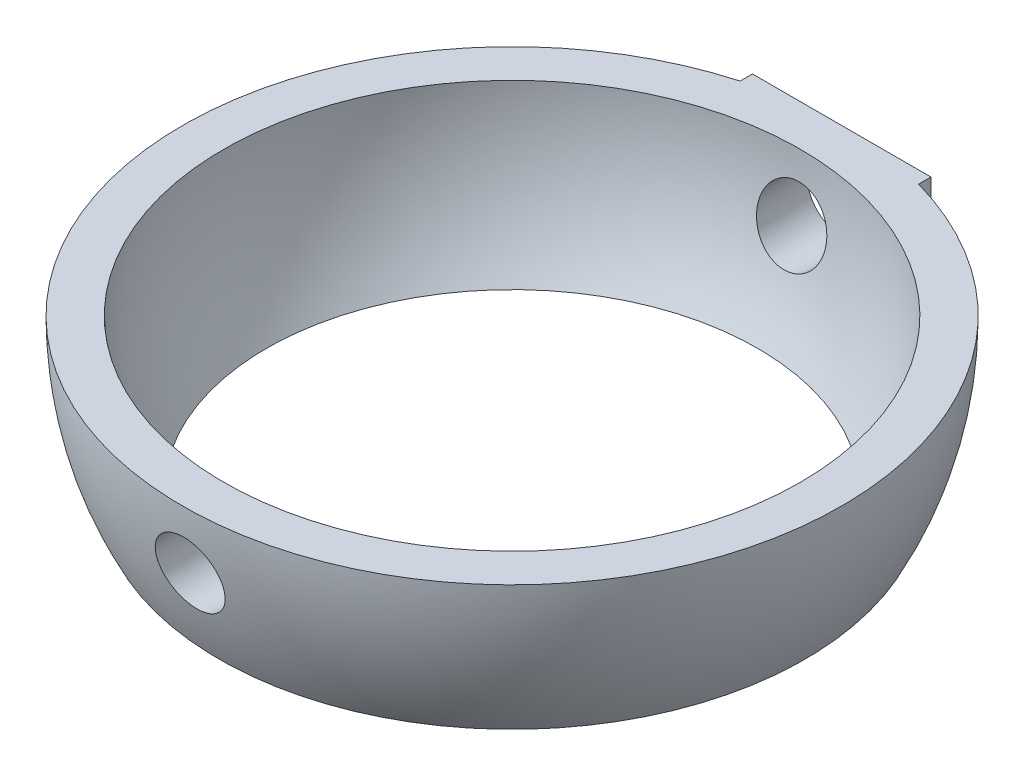
ISO-10303-21;
HEADER;
FILE_DESCRIPTION(('STEP AP214'),'2;1');
FILE_NAME('part.step','',(''),(''),'','','');
FILE_SCHEMA(('AUTOMOTIVE_DESIGN { 1 0 10303 214 1 1 1 1 }'));
ENDSEC;
DATA;
#1=APPLICATION_CONTEXT('core data for automotive mechanical design processes');
#2=APPLICATION_PROTOCOL_DEFINITION('international standard','automotive_design',2000,#1);
#3=PRODUCT_CONTEXT('',#1,'mechanical');
#4=PRODUCT('Part','Part','',(#3));
#5=PRODUCT_RELATED_PRODUCT_CATEGORY('part','',(#4));
#6=PRODUCT_DEFINITION_FORMATION('','',#4);
#7=PRODUCT_DEFINITION_CONTEXT('part definition',#1,'design');
#8=PRODUCT_DEFINITION('design','',#6,#7);
#9=PRODUCT_DEFINITION_SHAPE('','',#8);
#10=(LENGTH_UNIT() NAMED_UNIT(*) SI_UNIT(.MILLI.,.METRE.));
#11=(NAMED_UNIT(*) PLANE_ANGLE_UNIT() SI_UNIT($,.RADIAN.));
#12=(NAMED_UNIT(*) SI_UNIT($,.STERADIAN.) SOLID_ANGLE_UNIT());
#13=UNCERTAINTY_MEASURE_WITH_UNIT(LENGTH_MEASURE(1.E-05),#10,'distance_accuracy_value','');
#14=(GEOMETRIC_REPRESENTATION_CONTEXT(3) GLOBAL_UNCERTAINTY_ASSIGNED_CONTEXT((#13)) GLOBAL_UNIT_ASSIGNED_CONTEXT((#10,
#11,#12)) REPRESENTATION_CONTEXT('',''));
#15=CARTESIAN_POINT('',(0.,0.,0.));
#16=DIRECTION('',(0.,0.,1.));
#17=DIRECTION('',(1.,0.,0.));
#18=AXIS2_PLACEMENT_3D('',#15,#16,#17);
#19=CARTESIAN_POINT('',(1.99999999999911,8.45125390389451,10.8604392495042));
#20=DIRECTION('',(0.,-1.,0.));
#21=DIRECTION('',(0.,0.,-1.));
#22=AXIS2_PLACEMENT_3D('',#19,#20,#21);
#23=SPHERICAL_SURFACE('',#22,12.0000000000002);
#24=CARTESIAN_POINT('',(5.24999999999911,8.45125390389453,10.8604392495042));
#25=DIRECTION('',(-1.,0.,0.));
#26=DIRECTION('',(0.,-1.,0.));
#27=AXIS2_PLACEMENT_3D('',#24,#25,#26);
#28=CIRCLE('',#27,11.5515150521482);
#29=CARTESIAN_POINT('',(5.24999999999911,8.45125390389453,-0.691075802643992));
#30=VERTEX_POINT('',#29);
#31=CARTESIAN_POINT('',(5.24999999999915,2.95125390389453,0.702314422548877));
#32=VERTEX_POINT('',#31);
#33=EDGE_CURVE('E76',#30,#32,#28,.T.);
#34=ORIENTED_EDGE('',*,*,#33,.F.);
#35=CARTESIAN_POINT('',(1.99999999999911,8.45125390389451,10.8604392495042));
#36=DIRECTION('',(0.,-1.,0.));
#37=DIRECTION('',(1.,0.,0.));
#38=AXIS2_PLACEMENT_3D('',#35,#36,#37);
#39=CIRCLE('',#38,12.0000000000002);
#40=CARTESIAN_POINT('',(-1.25000000000089,8.45125390389448,-0.691075802643989));
#41=VERTEX_POINT('',#40);
#42=EDGE_CURVE('E11',#30,#41,#39,.T.);
#43=ORIENTED_EDGE('',*,*,#42,.T.);
#44=CARTESIAN_POINT('',(-1.25000000000089,8.45125390389448,10.8604392495042));
#45=DIRECTION('',(1.,0.,0.));
#46=DIRECTION('',(0.,1.,0.));
#47=AXIS2_PLACEMENT_3D('',#44,#45,#46);
#48=CIRCLE('',#47,11.5515150521482);
#49=CARTESIAN_POINT('',(-1.25000000000085,2.95125390389448,0.70231442254888));
#50=VERTEX_POINT('',#49);
#51=EDGE_CURVE('E87',#50,#41,#48,.T.);
#52=ORIENTED_EDGE('',*,*,#51,.F.);
#53=CARTESIAN_POINT('',(1.99999999999915,2.95125390389451,10.8604392495042));
#54=DIRECTION('',(0.,-1.,0.));
#55=DIRECTION('',(1.,0.,0.));
#56=AXIS2_PLACEMENT_3D('',#53,#54,#55);
#57=CIRCLE('',#56,10.665364503851);
#58=EDGE_CURVE('E107',#32,#50,#57,.T.);
#59=ORIENTED_EDGE('',*,*,#58,.F.);
#60=EDGE_LOOP('',(#34,#43,#52,#59));
#61=FACE_BOUND('',#60,.T.);
#62=CARTESIAN_POINT('',(1.29673030526111,5.16785575387462,22.3810602538127));
#63=CARTESIAN_POINT('',(1.35378193972209,5.12903322655064,22.3734781460178));
#64=CARTESIAN_POINT('',(1.41417537248651,5.09486455736147,22.3667974845374));
#65=CARTESIAN_POINT('',(1.53998590547275,5.03691178670672,22.3554596007657));
#66=CARTESIAN_POINT('',(1.60540796110348,5.01313808720956,22.3508044053269));
#67=CARTESIAN_POINT('',(1.73940914352778,4.97674969796272,22.343676767108));
#68=CARTESIAN_POINT('',(1.80798833865273,4.96413524985727,22.3412043715946));
#69=CARTESIAN_POINT('',(1.94631738467713,4.95047498719832,22.3385269268582));
#70=CARTESIAN_POINT('',(2.01606696364974,4.94942652168164,22.3383213580706));
#71=CARTESIAN_POINT('',(2.15428086043909,4.95889167251536,22.3401766490317));
#72=CARTESIAN_POINT('',(2.22275062661421,4.96932890016407,22.3422225348757));
#73=CARTESIAN_POINT('',(2.35693893691058,5.00131542256771,22.3484889771663));
#74=CARTESIAN_POINT('',(2.42265740770071,5.02286501330027,22.3527095915367));
#75=CARTESIAN_POINT('',(2.54964445906364,5.07646475079603,22.3631987532054));
#76=CARTESIAN_POINT('',(2.61090354645649,5.10853654205619,22.3694715217734));
#77=CARTESIAN_POINT('',(2.72715930294817,5.18219764833665,22.3838631521617));
#78=CARTESIAN_POINT('',(2.78215563371754,5.22378747717973,22.3919821136469));
#79=CARTESIAN_POINT('',(2.88510683239969,5.31586320813779,22.4099337516824));
#80=CARTESIAN_POINT('',(2.93296090469321,5.36645769567281,22.4197873277228));
#81=CARTESIAN_POINT('',(3.01952045857417,5.47469924626093,22.440837112271));
#82=CARTESIAN_POINT('',(3.05822512259555,5.53234693887115,22.4520334406289));
#83=CARTESIAN_POINT('',(3.12612051312935,5.65416922971458,22.4756560259426));
#84=CARTESIAN_POINT('',(3.15512780019034,5.71844249076696,22.4881007673237));
#85=CARTESIAN_POINT('',(3.20192579843313,5.8508196549216,22.5136881315455));
#86=CARTESIAN_POINT('',(3.2197155082734,5.91892389940726,22.5268308165749));
#87=CARTESIAN_POINT('',(3.24381645142147,6.05812958923193,22.5536476611273));
#88=CARTESIAN_POINT('',(3.24995092910667,6.12926071470147,22.5673268422092));
#89=CARTESIAN_POINT('',(3.25004848944781,6.27154202142602,22.5946406750296));
#90=CARTESIAN_POINT('',(3.24401098576694,6.34269220343393,22.6082753245913));
#91=CARTESIAN_POINT('',(3.21984144416005,6.48340899452135,22.6351953044921));
#92=CARTESIAN_POINT('',(3.20164126062624,6.55296438428403,22.6484782257488));
#93=CARTESIAN_POINT('',(3.15354004646415,6.68806653632663,22.6742372361325));
#94=CARTESIAN_POINT('',(3.12363919736189,6.75361336077784,22.686713337773));
#95=CARTESIAN_POINT('',(3.05313681812303,6.87838473561806,22.7104278012786));
#96=CARTESIAN_POINT('',(3.01260140569837,6.93764527855383,22.7216732227171));
#97=CARTESIAN_POINT('',(2.92183628729249,7.04851363099507,22.7426856429978));
#98=CARTESIAN_POINT('',(2.87160731548549,7.10012201953898,22.7524527537051));
#99=CARTESIAN_POINT('',(2.76367325319885,7.19337986643218,22.7700842319394));
#100=CARTESIAN_POINT('',(2.7060911437291,7.23516666374929,22.7779748601235));
#101=CARTESIAN_POINT('',(2.5845036198003,7.30845420892644,22.7918033534175));
#102=CARTESIAN_POINT('',(2.52049885034814,7.33995598832857,22.7977414143617));
#103=CARTESIAN_POINT('',(2.38906184851704,7.39122113754262,22.8074001853829));
#104=CARTESIAN_POINT('',(2.32170695948654,7.4111760570746,22.8111570823015));
#105=CARTESIAN_POINT('',(2.18452625283395,7.43954087881229,22.8164962339653));
#106=CARTESIAN_POINT('',(2.11470062988972,7.44795168855047,22.8180786596552));
#107=CARTESIAN_POINT('',(1.97544298020605,7.45293055079232,22.8190154656657));
#108=CARTESIAN_POINT('',(1.90601604893547,7.44963733797271,22.8183959469239));
#109=CARTESIAN_POINT('',(1.76871747661964,7.43162050171053,22.8150054281088));
#110=CARTESIAN_POINT('',(1.70084579689752,7.41689716283703,22.8122344815983));
#111=CARTESIAN_POINT('',(1.56868644284071,7.37651358382059,22.8046295892646));
#112=CARTESIAN_POINT('',(1.5043930522217,7.35087138864043,22.7997990471988));
#113=CARTESIAN_POINT('',(1.38104511609532,7.28943710808301,22.7882159832034));
#114=CARTESIAN_POINT('',(1.3219907400199,7.2536446946004,22.7814633991438));
#115=CARTESIAN_POINT('',(1.21020612427928,7.17261071062665,22.7661590733559));
#116=CARTESIAN_POINT('',(1.15753775296167,7.1272867970583,22.7575916480901));
#117=CARTESIAN_POINT('',(1.06054260442089,7.02872104991794,22.7389361661186));
#118=CARTESIAN_POINT('',(1.01621647737289,6.97547859977201,22.7288479909995));
#119=CARTESIAN_POINT('',(0.936405167125882,6.86168702962143,22.7072560059255));
#120=CARTESIAN_POINT('',(0.901072215923336,6.80103494482182,22.6957321892106));
#121=CARTESIAN_POINT('',(0.841079310414965,6.67484151828099,22.6717172642227));
#122=CARTESIAN_POINT('',(0.816420334600275,6.60929972894233,22.6592260673929));
#123=CARTESIAN_POINT('',(0.778070299754098,6.47403550423578,22.6334034668562));
#124=CARTESIAN_POINT('',(0.764565886542451,6.40426211031036,22.6200616382839));
#125=CARTESIAN_POINT('',(0.749544987551834,6.26349134542174,22.5930966743161));
#126=CARTESIAN_POINT('',(0.748028870336487,6.19249393689514,22.5794735302848));
#127=CARTESIAN_POINT('',(0.75706212110357,6.05054751399651,22.5521888685675));
#128=CARTESIAN_POINT('',(0.767730360410549,5.97960585020772,22.5385282923568));
#129=CARTESIAN_POINT('',(0.801059500862486,5.84047834776141,22.5116919785925));
#130=CARTESIAN_POINT('',(0.823723502425358,5.77229322646459,22.4985163673248));
#131=CARTESIAN_POINT('',(0.880434889674624,5.64071404521043,22.473050189778));
#132=CARTESIAN_POINT('',(0.914474715240626,5.57731683752652,22.4607590422795));
#133=CARTESIAN_POINT('',(0.993020896983957,5.45719045465263,22.4374358546821));
#134=CARTESIAN_POINT('',(1.03751412575323,5.40045304899702,22.426402260945));
#135=CARTESIAN_POINT('',(1.11808841659872,5.31419937173916,22.4096079627622));
#136=CARTESIAN_POINT('',(1.15147139826752,5.28221374937775,22.403374481498));
#137=CARTESIAN_POINT('',(1.22164446948918,5.22207172678937,22.3916453671379));
#138=CARTESIAN_POINT('',(1.25843452444386,5.19391528768495,22.3861497265507));
#139=CARTESIAN_POINT('',(1.29673030526111,5.16785575387462,22.3810602538127));
#140=B_SPLINE_CURVE_WITH_KNOTS('',3,(#62,#63,#64,#65,#66,#67,#68,#69,#70,#71,#72,#73,#74,#75,
#76,#77,#78,#79,#80,#81,#82,#83,#84,#85,#86,#87,#88,#89,#90,#91,#92,#93,#94,#95,#96,#97,#98,#99,
#100,#101,#102,#103,#104,#105,#106,#107,#108,#109,#110,#111,#112,#113,#114,#115,#116,#117,#118,
#119,#120,#121,#122,#123,#124,#125,#126,#127,#128,#129,#130,#131,#132,#133,#134,#135,#136,#137,
#138,#139),.UNSPECIFIED.,.T.,.F.,(4,2,2,2,2,2,2,2,2,2,2,2,2,2,2,2,2,2,2,2,2,2,2,2,2,2,2,2,2,2,2,
2,2,2,2,2,2,2,4),(0.,0.208102192686616,0.416412153738015,0.624726625456409,0.832993349785472,
1.03988326604719,1.2467786931037,1.45410240728313,1.66143731629017,1.87146665448443,
2.08151475323664,2.2953369434356,2.50917821785728,2.72623736091116,2.94330696017614,
3.16160307887352,3.37989581102383,3.59686226556617,3.81381229387121,4.02751923980198,
4.24120474527613,4.45123554007548,4.66124982249849,4.86878302785194,5.07631106653969,
5.28349745866561,5.49069054884609,5.69975308005039,5.90883189836191,6.12124434668098,
6.33367626288304,6.54959458251175,6.76551954022554,6.98356920222322,7.20167524875276,
7.41963663413537,7.63732575250763,7.77701529784752,7.91670342482252),.UNSPECIFIED.);
#141=CARTESIAN_POINT('',(1.29673030526111,5.16785575387462,22.3810602538127));
#142=VERTEX_POINT('',#141);
#143=EDGE_CURVE('E98',#142,#142,#140,.T.);
#144=ORIENTED_EDGE('',*,*,#143,.F.);
#145=EDGE_LOOP('',(#144));
#146=FACE_BOUND('',#145,.T.);
#147=ADVANCED_FACE('F33',(#61,#146),#23,.T.);
#148=CARTESIAN_POINT('',(1.99999999999911,8.45125390389451,10.8604392495042));
#149=DIRECTION('',(0.,-1.,0.));
#150=DIRECTION('',(0.,0.,-1.));
#151=AXIS2_PLACEMENT_3D('',#148,#149,#150);
#152=SPHERICAL_SURFACE('',#151,10.5);
#153=CARTESIAN_POINT('',(1.99999999999911,8.45125390389451,10.8604392495042));
#154=DIRECTION('',(0.,-1.,0.));
#155=DIRECTION('',(1.,0.,0.));
#156=AXIS2_PLACEMENT_3D('',#153,#154,#155);
#157=CIRCLE('',#156,10.5);
#158=CARTESIAN_POINT('',(12.4999999999991,8.45125390389458,10.8604392495042));
#159=VERTEX_POINT('',#158);
#160=EDGE_CURVE('E41',#159,#159,#157,.T.);
#161=ORIENTED_EDGE('',*,*,#160,.F.);
#162=EDGE_LOOP('',(#161));
#163=FACE_BOUND('',#162,.T.);
#164=CARTESIAN_POINT('',(1.99999999999915,2.95125390389451,10.8604392495042));
#165=DIRECTION('',(0.,-1.,0.));
#166=DIRECTION('',(1.,0.,0.));
#167=AXIS2_PLACEMENT_3D('',#164,#165,#166);
#168=CIRCLE('',#167,8.94427190999915);
#169=CARTESIAN_POINT('',(10.9442719099983,2.95125390389457,10.8604392495042));
#170=VERTEX_POINT('',#169);
#171=EDGE_CURVE('E109',#170,#170,#168,.T.);
#172=ORIENTED_EDGE('',*,*,#171,.T.);
#173=EDGE_LOOP('',(#172));
#174=FACE_BOUND('',#173,.T.);
#175=CARTESIAN_POINT('',(1.35393932418165,5.13115921097286,20.8007386434795));
#176=CARTESIAN_POINT('',(1.29339687904826,5.16771570450615,20.809012897377));
#177=CARTESIAN_POINT('',(1.23602768042895,5.2093837470591,20.8184352869619));
#178=CARTESIAN_POINT('',(1.12928018464424,5.30162157343088,20.8392553368649));
#179=CARTESIAN_POINT('',(1.07991390374228,5.35220450946784,20.8506559152318));
#180=CARTESIAN_POINT('',(0.990595997678212,5.46062786657211,20.8750450304198));
#181=CARTESIAN_POINT('',(0.950630337969217,5.51845726869998,20.888031155514));
#182=CARTESIAN_POINT('',(0.881030189789038,5.63974192282272,20.9152083215619));
#183=CARTESIAN_POINT('',(0.851393110809261,5.70319575913945,20.929399059275));
#184=CARTESIAN_POINT('',(0.80271779776943,5.83513276977595,20.9588388737905));
#185=CARTESIAN_POINT('',(0.783873704489316,5.90368442443339,20.9741021055445));
#186=CARTESIAN_POINT('',(0.758050069734463,6.04290533301513,21.0050274916094));
#187=CARTESIAN_POINT('',(0.751072209844868,6.11357488562678,21.0206897021412));
#188=CARTESIAN_POINT('',(0.749142761775378,6.25613233779907,21.0522106814817));
#189=CARTESIAN_POINT('',(0.75436994942043,6.32802284211878,21.0680689448307));
#190=CARTESIAN_POINT('',(0.777106094748337,6.4699460630025,21.0993043608787));
#191=CARTESIAN_POINT('',(0.794615350273378,6.539978734471,21.114681501901));
#192=CARTESIAN_POINT('',(0.84149018977575,6.6761647302857,21.1445202225483));
#193=CARTESIAN_POINT('',(0.870855020097026,6.74231830091933,21.158981860304));
#194=CARTESIAN_POINT('',(0.940697682910845,6.86878308141751,21.1865746283983));
#195=CARTESIAN_POINT('',(0.981174787794807,6.92909467345297,21.1997058457728));
#196=CARTESIAN_POINT('',(1.07150209620201,7.04119302348841,21.2240714605286));
#197=CARTESIAN_POINT('',(1.12120785220595,7.09309072859348,21.235330604882));
#198=CARTESIAN_POINT('',(1.22900947239039,7.18777197760937,21.255843850018));
#199=CARTESIAN_POINT('',(1.28710430157786,7.23055664422243,21.2650981977886));
#200=CARTESIAN_POINT('',(1.40864964102636,7.30477669640375,21.2811357559689));
#201=CARTESIAN_POINT('',(1.47195227531627,7.33644336469347,21.2879693551247));
#202=CARTESIAN_POINT('',(1.60317621512512,7.38869499728269,21.2992378818005));
#203=CARTESIAN_POINT('',(1.67109693634757,7.40928136057333,21.3036731121371));
#204=CARTESIAN_POINT('',(1.80815915998452,7.43839060774446,21.3099428199092));
#205=CARTESIAN_POINT('',(1.87724870830192,7.44714758148186,21.3118277657281));
#206=CARTESIAN_POINT('',(2.01594398991338,7.45307762433505,21.3131043256557));
#207=CARTESIAN_POINT('',(2.0855496859141,7.45025152238,21.3124961181841));
#208=CARTESIAN_POINT('',(2.22260804912267,7.43319143750998,21.3088229592203));
#209=CARTESIAN_POINT('',(2.29007485873103,7.41906567917702,21.3057813143948));
#210=CARTESIAN_POINT('',(2.4216420747693,7.37999361075655,21.2973615098299));
#211=CARTESIAN_POINT('',(2.48574246500763,7.35504724863013,21.2919833388536));
#212=CARTESIAN_POINT('',(2.60911260715897,7.29496861911015,21.2790168034106));
#213=CARTESIAN_POINT('',(2.66835782988956,7.25978828033426,21.2714180073581));
#214=CARTESIAN_POINT('',(2.78009484894668,7.18036150712719,21.2542382560015));
#215=CARTESIAN_POINT('',(2.83258615588468,7.13611441632102,21.2446571571909));
#216=CARTESIAN_POINT('',(2.93029063564021,7.03903738644769,21.2236018024195));
#217=CARTESIAN_POINT('',(2.97536619902179,6.98607533472645,21.2120983550036));
#218=CARTESIAN_POINT('',(3.05601412228365,6.87365379823688,21.1876338823565));
#219=CARTESIAN_POINT('',(3.09158542848497,6.81419359408684,21.1746726957409));
#220=CARTESIAN_POINT('',(3.1530472563738,6.6890532518997,21.1473380882224));
#221=CARTESIAN_POINT('',(3.17870500306505,6.62326423064624,21.1329396789544));
#222=CARTESIAN_POINT('',(3.21858431679462,6.48847126779569,21.1033732346781));
#223=CARTESIAN_POINT('',(3.23280462427753,6.41946697299951,21.0882051151005));
#224=CARTESIAN_POINT('',(3.24963632329295,6.27882560695997,21.0572189853436));
#225=CARTESIAN_POINT('',(3.2520259472523,6.20716343419922,21.0413941283445));
#226=CARTESIAN_POINT('',(3.24454579354328,6.06446449302371,21.0098085461361));
#227=CARTESIAN_POINT('',(3.23467525255631,5.99342776382643,20.9940478249812));
#228=CARTESIAN_POINT('',(3.20280549677639,5.85348321160222,20.9629278402557));
#229=CARTESIAN_POINT('',(3.18072178451412,5.78459379266745,20.9475721633361));
#230=CARTESIAN_POINT('',(3.1249199809973,5.6514689576341,20.9178339918104));
#231=CARTESIAN_POINT('',(3.09120211335519,5.58723345211444,20.903451478506));
#232=CARTESIAN_POINT('',(3.01333759228538,5.4658622576949,20.8762228748671));
#233=CARTESIAN_POINT('',(2.96928239215112,5.40867065805506,20.8633647203538));
#234=CARTESIAN_POINT('',(2.87176183467356,5.30251927445498,20.8394591076223));
#235=CARTESIAN_POINT('',(2.81829750006422,5.25355859695736,20.828411452862));
#236=CARTESIAN_POINT('',(2.70466449416412,5.16637788680604,20.80871313101));
#237=CARTESIAN_POINT('',(2.64466040596661,5.12795368443265,20.8000169529319));
#238=CARTESIAN_POINT('',(2.51876496109146,5.06176370939274,20.785022396467));
#239=CARTESIAN_POINT('',(2.4528747161762,5.0339959291933,20.7787235664524));
#240=CARTESIAN_POINT('',(2.31878627958159,4.99058374651762,20.7688704148701));
#241=CARTESIAN_POINT('',(2.25068196936597,4.9746633176506,20.7652536134195));
#242=CARTESIAN_POINT('',(2.11266787351671,4.95439004519961,20.7606472283715));
#243=CARTESIAN_POINT('',(2.04275780872839,4.95003900108467,20.7596580534677));
#244=CARTESIAN_POINT('',(1.90425697360907,4.95303015916666,20.7603379048727));
#245=CARTESIAN_POINT('',(1.83566207835017,4.96019891923465,20.761967502959));
#246=CARTESIAN_POINT('',(1.70074537739757,4.98566850483341,20.7677533802674));
#247=CARTESIAN_POINT('',(1.63442077851313,5.00395509072126,20.7719064274674));
#248=CARTESIAN_POINT('',(1.53250394126945,5.04127045488736,20.7803729975757));
#249=CARTESIAN_POINT('',(1.49554918350526,5.05686237852099,20.7839093239724));
#250=CARTESIAN_POINT('',(1.42337169196529,5.09147863718361,20.791754464196));
#251=CARTESIAN_POINT('',(1.38814892586009,5.11050290811329,20.7960632635969));
#252=CARTESIAN_POINT('',(1.35393932418165,5.13115921097286,20.8007386434795));
#253=B_SPLINE_CURVE_WITH_KNOTS('',3,(#175,#176,#177,#178,#179,#180,#181,#182,#183,#184,#185,
#186,#187,#188,#189,#190,#191,#192,#193,#194,#195,#196,#197,#198,#199,#200,#201,#202,#203,#204,
#205,#206,#207,#208,#209,#210,#211,#212,#213,#214,#215,#216,#217,#218,#219,#220,#221,#222,#223,
#224,#225,#226,#227,#228,#229,#230,#231,#232,#233,#234,#235,#236,#237,#238,#239,#240,#241,#242,
#243,#244,#245,#246,#247,#248,#249,#250,#251,#252),.UNSPECIFIED.,.T.,.F.,(4,2,2,2,2,2,2,2,2,2,2,
2,2,2,2,2,2,2,2,2,2,2,2,2,2,2,2,2,2,2,2,2,2,2,2,2,2,2,4),(0.,0.213465251244886,0.42724810683301,
0.640709742806467,0.854117801927988,1.07125288361689,1.28841873334291,1.50878547484239,
1.7291575604567,1.94951563927547,2.16985929294637,2.38700739376562,2.60412872701988,
2.81642043687603,3.02868533664627,3.23668501511199,3.44466980858587,3.65068610204332,
3.85670338629411,4.06370445438295,4.27072051332586,4.48122638110192,4.69175557670392,
4.90696470137658,5.1221975228496,5.34145002390669,5.56071617632201,5.78151866222925,
6.00231690447357,6.22123088678869,6.44012108874062,6.65440935715918,6.86865723658332,
7.07774212368531,7.28685952935144,7.49285785340159,7.6985928902624,7.81921401095592,
7.93983287927526),.UNSPECIFIED.);
#254=CARTESIAN_POINT('',(1.35393932418165,5.13115921097286,20.8007386434795));
#255=VERTEX_POINT('',#254);
#256=EDGE_CURVE('E125',#255,#255,#253,.T.);
#257=ORIENTED_EDGE('',*,*,#256,.F.);
#258=EDGE_LOOP('',(#257));
#259=FACE_BOUND('',#258,.T.);
#260=CARTESIAN_POINT('',(1.28413299563357,5.17654202630779,0.909871599824233));
#261=CARTESIAN_POINT('',(1.34039862383318,5.13723801424449,0.918758923412564));
#262=CARTESIAN_POINT('',(1.40005235830383,5.10247826353342,0.926630590913294));
#263=CARTESIAN_POINT('',(1.52452525580491,5.04315854601264,0.940075524004077));
#264=CARTESIAN_POINT('',(1.58934916532535,5.01860808336046,0.945646647909863));
#265=CARTESIAN_POINT('',(1.72233923943459,4.98052144641846,0.954293540867556));
#266=CARTESIAN_POINT('',(1.79050611595225,4.96698762916297,0.957368775918408));
#267=CARTESIAN_POINT('',(1.92819214059053,4.95139672572697,0.960911688282879));
#268=CARTESIAN_POINT('',(1.99771097982408,4.9493370482216,0.961379954355522));
#269=CARTESIAN_POINT('',(2.13545295391121,4.95671972343476,0.959702063977873));
#270=CARTESIAN_POINT('',(2.20368212605281,4.96605550919924,0.957580130290081));
#271=CARTESIAN_POINT('',(2.33756911201464,4.99574602840866,0.95083654336819));
#272=CARTESIAN_POINT('',(2.4032268741174,5.01610098335464,0.946214839885146));
#273=CARTESIAN_POINT('',(2.53027884728638,5.06723303002966,0.93461739280717));
#274=CARTESIAN_POINT('',(2.59166410357615,5.09803126145146,0.927636874506035));
#275=CARTESIAN_POINT('',(2.70837895035006,5.16908710689527,0.911554194823304));
#276=CARTESIAN_POINT('',(2.76370812382751,5.2093453717116,0.902451887475521));
#277=CARTESIAN_POINT('',(2.86775953047424,5.2988777169968,0.882242484499315));
#278=CARTESIAN_POINT('',(2.91635489350916,5.34829213361055,0.871104225820565));
#279=CARTESIAN_POINT('',(3.00459118923839,5.45422625310778,0.847272049318592));
#280=CARTESIAN_POINT('',(3.04423108073574,5.51074678098677,0.834577950871936));
#281=CARTESIAN_POINT('',(3.11442715461795,5.63073078805867,0.807686852511295));
#282=CARTESIAN_POINT('',(3.14474470262542,5.69432748953954,0.793461274931167));
#283=CARTESIAN_POINT('',(3.19425789821305,5.82553269115791,0.764179107128288));
#284=CARTESIAN_POINT('',(3.21345223851802,5.89314166181568,0.749122419455474));
#285=CARTESIAN_POINT('',(3.240534726915,6.03192509490461,0.718286484699975));
#286=CARTESIAN_POINT('',(3.24818554719941,6.10314406920069,0.702498775272013));
#287=CARTESIAN_POINT('',(3.25124165063024,6.2458503492443,0.670938127780745));
#288=CARTESIAN_POINT('',(3.24664611509976,6.31733767261212,0.655165190775498));
#289=CARTESIAN_POINT('',(3.22522286402657,6.45915419100292,0.623945857275297));
#290=CARTESIAN_POINT('',(3.20829648787822,6.52946933747961,0.608503134947216));
#291=CARTESIAN_POINT('',(3.1625100568249,6.66630786187894,0.578514925011875));
#292=CARTESIAN_POINT('',(3.13365020028335,6.73283130280801,0.56396942249526));
#293=CARTESIAN_POINT('',(3.06498528979534,6.85963544115998,0.536297290429802));
#294=CARTESIAN_POINT('',(3.02526278739784,6.91995868129805,0.523160960196392));
#295=CARTESIAN_POINT('',(2.93582591206605,7.03307520274054,0.498569375307726));
#296=CARTESIAN_POINT('',(2.88611252301766,7.0858692246353,0.487113955311264));
#297=CARTESIAN_POINT('',(2.77911651842469,7.18131393681642,0.466432548188764));
#298=CARTESIAN_POINT('',(2.72199864606101,7.22414084719646,0.457167773789693));
#299=CARTESIAN_POINT('',(2.60107808837218,7.29956189630721,0.440868593751457));
#300=CARTESIAN_POINT('',(2.53727629552357,7.33215739887908,0.433833890843719));
#301=CARTESIAN_POINT('',(2.40634418120435,7.38542771575529,0.422344855454401));
#302=CARTESIAN_POINT('',(2.33932089710246,7.40635398399976,0.417836082275777));
#303=CARTESIAN_POINT('',(2.20260424115344,7.43671055224588,0.411297382694973));
#304=CARTESIAN_POINT('',(2.13291115137405,7.4461420632445,0.409267195168517));
#305=CARTESIAN_POINT('',(1.99401671977864,7.45314177048793,0.407760361151596));
#306=CARTESIAN_POINT('',(1.92482510179939,7.45089569528348,0.408243737198383));
#307=CARTESIAN_POINT('',(1.78782017201139,7.43504265539659,0.411656916361197));
#308=CARTESIAN_POINT('',(1.72000681127361,7.42143609474283,0.414586632474645));
#309=CARTESIAN_POINT('',(1.58786381238341,7.38335332865332,0.422792769364581));
#310=CARTESIAN_POINT('',(1.5235249944278,7.35890751344084,0.428062629097396));
#311=CARTESIAN_POINT('',(1.39989441774118,7.29991903024534,0.440792739505106));
#312=CARTESIAN_POINT('',(1.34060285362762,7.26537597314951,0.448253074593404));
#313=CARTESIAN_POINT('',(1.22801812641364,7.1868036803389,0.465245805278551));
#314=CARTESIAN_POINT('',(1.17479891608307,7.14267332637347,0.474800298551872));
#315=CARTESIAN_POINT('',(1.0765084213064,7.04647209772188,0.495662817789756));
#316=CARTESIAN_POINT('',(1.03143792679988,6.99440045410514,0.506971013561711));
#317=CARTESIAN_POINT('',(0.9497332284129,6.88266899604772,0.531280601256063));
#318=CARTESIAN_POINT('',(0.913290333526992,6.8228758127927,0.544311882531562));
#319=CARTESIAN_POINT('',(0.850943239863247,6.69826888246876,0.57152519473609));
#320=CARTESIAN_POINT('',(0.825040279980914,6.63345454626375,0.58570736070869));
#321=CARTESIAN_POINT('',(0.78394016155917,6.49914073145384,0.615161700704276));
#322=CARTESIAN_POINT('',(0.768987520290347,6.42957010505863,0.630450849819719));
#323=CARTESIAN_POINT('',(0.751070454925678,6.28898762572872,0.661417655681709));
#324=CARTESIAN_POINT('',(0.748106701078291,6.21797569243963,0.677095334100004));
#325=CARTESIAN_POINT('',(0.754272736013615,6.07547948680517,0.708628226035044));
#326=CARTESIAN_POINT('',(0.763570704690068,6.0040023084742,0.724482888637963));
#327=CARTESIAN_POINT('',(0.794329173236893,5.86357840731829,0.755702534977041));
#328=CARTESIAN_POINT('',(0.815792949003103,5.79463237138239,0.771067385643663));
#329=CARTESIAN_POINT('',(0.870348750526448,5.66127110178528,0.800851810499739));
#330=CARTESIAN_POINT('',(0.903443063148846,5.5968567621648,0.815271198124531));
#331=CARTESIAN_POINT('',(0.980389356991307,5.47454819521069,0.842704360443833));
#332=CARTESIAN_POINT('',(1.02422776930322,5.41664587725897,0.855719878481374));
#333=CARTESIAN_POINT('',(1.10430106636899,5.32808010106092,0.875661847344561));
#334=CARTESIAN_POINT('',(1.13777891418782,5.29500389564141,0.8831187471999));
#335=CARTESIAN_POINT('',(1.2083481079282,5.23274948208296,0.897167731097485));
#336=CARTESIAN_POINT('',(1.24543939218843,5.2035712074481,0.903759829892588));
#337=CARTESIAN_POINT('',(1.28413299563357,5.17654202630779,0.909871599824233));
#338=B_SPLINE_CURVE_WITH_KNOTS('',3,(#260,#261,#262,#263,#264,#265,#266,#267,#268,#269,#270,
#271,#272,#273,#274,#275,#276,#277,#278,#279,#280,#281,#282,#283,#284,#285,#286,#287,#288,#289,
#290,#291,#292,#293,#294,#295,#296,#297,#298,#299,#300,#301,#302,#303,#304,#305,#306,#307,#308,
#309,#310,#311,#312,#313,#314,#315,#316,#317,#318,#319,#320,#321,#322,#323,#324,#325,#326,#327,
#328,#329,#330,#331,#332,#333,#334,#335,#336,#337),.UNSPECIFIED.,.T.,.F.,(4,2,2,2,2,2,2,2,2,2,2,
2,2,2,2,2,2,2,2,2,2,2,2,2,2,2,2,2,2,2,2,2,2,2,2,2,2,2,4),(0.,0.20745159840372,0.415095890222266,
0.622784596303139,0.830426395971684,1.03614118030539,1.24186009995383,1.44799795484039,
1.65414999494547,1.86377165667992,2.07341767729292,2.28805305305744,2.50271364912126,
2.72173012010705,2.94076123285467,3.16156436204327,3.38236382109537,3.60152981609916,
3.82067423856691,4.03558595497148,4.2504690115822,4.46052254488209,4.67055394668474,
4.87725518077388,5.0839490639738,5.29006706437205,5.49619300889326,5.70460878872856,
5.91304476164812,6.12574199826391,6.33846422873232,6.55580260238944,6.77315312635641,
6.99351602249531,7.21393828412198,7.43440391075466,7.65459252947557,7.79725843573374,
7.93992190790216),.UNSPECIFIED.);
#339=CARTESIAN_POINT('',(1.28413299563357,5.17654202630779,0.909871599824233));
#340=VERTEX_POINT('',#339);
#341=EDGE_CURVE('E128',#340,#340,#338,.T.);
#342=ORIENTED_EDGE('',*,*,#341,.F.);
#343=EDGE_LOOP('',(#342));
#344=FACE_BOUND('',#343,.T.);
#345=ADVANCED_FACE('F116',(#163,#174,#259,#344),#152,.F.);
#346=CARTESIAN_POINT('',(1.99999999999911,8.45125390389451,0.360439249504168));
#347=DIRECTION('',(0.,-1.,0.));
#348=DIRECTION('',(1.,0.,0.));
#349=AXIS2_PLACEMENT_3D('',#346,#347,#348);
#350=PLANE('',#349);
#351=ORIENTED_EDGE('',*,*,#42,.F.);
#352=DIRECTION('',(0.,0.,-1.));
#353=VECTOR('',#352,1.);
#354=CARTESIAN_POINT('',(5.24999999999911,8.45125390389453,22.8614392495044));
#355=LINE('',#354,#353);
#356=CARTESIAN_POINT('',(5.24999999999911,8.45125390389453,-1.13956075049606));
#357=VERTEX_POINT('',#356);
#358=EDGE_CURVE('E55',#30,#357,#355,.T.);
#359=ORIENTED_EDGE('',*,*,#358,.T.);
#360=DIRECTION('',(-1.,0.,0.));
#361=VECTOR('',#360,1.);
#362=CARTESIAN_POINT('',(5.24999999999911,8.45125390389453,-1.13956075049606));
#363=LINE('',#362,#361);
#364=CARTESIAN_POINT('',(-1.25000000000089,8.45125390389448,-1.13956075049606));
#365=VERTEX_POINT('',#364);
#366=EDGE_CURVE('E91',#357,#365,#363,.T.);
#367=ORIENTED_EDGE('',*,*,#366,.T.);
#368=DIRECTION('',(0.,0.,-1.));
#369=VECTOR('',#368,1.);
#370=CARTESIAN_POINT('',(-1.25000000000089,8.45125390389448,22.8614392495044));
#371=LINE('',#370,#369);
#372=EDGE_CURVE('E100',#41,#365,#371,.T.);
#373=ORIENTED_EDGE('',*,*,#372,.F.);
#374=EDGE_LOOP('',(#351,#359,#367,#373));
#375=FACE_BOUND('',#374,.T.);
#376=ORIENTED_EDGE('',*,*,#160,.T.);
#377=EDGE_LOOP('',(#376));
#378=FACE_BOUND('',#377,.T.);
#379=ADVANCED_FACE('F114',(#375,#378),#350,.F.);
#380=CARTESIAN_POINT('',(1.99999999999915,2.95125390389451,0.195074745653142));
#381=DIRECTION('',(0.,1.,0.));
#382=DIRECTION('',(-1.,0.,0.));
#383=AXIS2_PLACEMENT_3D('',#380,#381,#382);
#384=PLANE('',#383);
#385=ORIENTED_EDGE('',*,*,#171,.F.);
#386=EDGE_LOOP('',(#385));
#387=FACE_BOUND('',#386,.T.);
#388=ORIENTED_EDGE('',*,*,#58,.T.);
#389=DIRECTION('',(0.,0.,-1.));
#390=VECTOR('',#389,1.);
#391=CARTESIAN_POINT('',(-1.25000000000085,2.95125390389448,22.8614392495044));
#392=LINE('',#391,#390);
#393=CARTESIAN_POINT('',(-1.25000000000085,2.95125390389448,-1.13956075049606));
#394=VERTEX_POINT('',#393);
#395=EDGE_CURVE('E83',#50,#394,#392,.T.);
#396=ORIENTED_EDGE('',*,*,#395,.T.);
#397=DIRECTION('',(1.,0.,0.));
#398=VECTOR('',#397,1.);
#399=CARTESIAN_POINT('',(-1.25000000000085,2.95125390389448,-1.13956075049606));
#400=LINE('',#399,#398);
#401=CARTESIAN_POINT('',(5.24999999999915,2.95125390389453,-1.13956075049606));
#402=VERTEX_POINT('',#401);
#403=EDGE_CURVE('E81',#394,#402,#400,.T.);
#404=ORIENTED_EDGE('',*,*,#403,.T.);
#405=DIRECTION('',(0.,0.,-1.));
#406=VECTOR('',#405,1.);
#407=CARTESIAN_POINT('',(5.24999999999915,2.95125390389453,22.8614392495044));
#408=LINE('',#407,#406);
#409=EDGE_CURVE('E48',#32,#402,#408,.T.);
#410=ORIENTED_EDGE('',*,*,#409,.F.);
#411=EDGE_LOOP('',(#388,#396,#404,#410));
#412=FACE_BOUND('',#411,.T.);
#413=ADVANCED_FACE('F82',(#387,#412),#384,.F.);
#414=CARTESIAN_POINT('',(1.99999999999912,6.20125390389451,22.8614392495044));
#415=DIRECTION('',(0.,0.,-1.));
#416=DIRECTION('',(-1.,0.,0.));
#417=AXIS2_PLACEMENT_3D('',#414,#415,#416);
#418=CYLINDRICAL_SURFACE('',#417,1.24999999999999);
#419=CARTESIAN_POINT('',(1.99999999999912,6.20125390389451,-1.13956075049606));
#420=DIRECTION('',(0.,0.,1.));
#421=DIRECTION('',(1.,0.,0.));
#422=AXIS2_PLACEMENT_3D('',#419,#420,#421);
#423=CIRCLE('',#422,1.24999999999999);
#424=CARTESIAN_POINT('',(3.24999999999911,6.20125390389451,-1.13956075049606));
#425=VERTEX_POINT('',#424);
#426=EDGE_CURVE('E78',#425,#425,#423,.T.);
#427=ORIENTED_EDGE('',*,*,#426,.F.);
#428=EDGE_LOOP('',(#427));
#429=FACE_BOUND('',#428,.T.);
#430=ORIENTED_EDGE('',*,*,#341,.T.);
#431=EDGE_LOOP('',(#430));
#432=FACE_BOUND('',#431,.T.);
#433=ADVANCED_FACE('F153',(#429,#432),#418,.F.);
#434=CARTESIAN_POINT('',(5.24999999999915,2.95125390389453,22.8614392495044));
#435=DIRECTION('',(-1.,0.,0.));
#436=DIRECTION('',(0.,-1.,0.));
#437=AXIS2_PLACEMENT_3D('',#434,#435,#436);
#438=PLANE('',#437);
#439=ORIENTED_EDGE('',*,*,#358,.F.);
#440=ORIENTED_EDGE('',*,*,#33,.T.);
#441=ORIENTED_EDGE('',*,*,#409,.T.);
#442=DIRECTION('',(0.,1.,0.));
#443=VECTOR('',#442,1.);
#444=CARTESIAN_POINT('',(5.24999999999915,2.95125390389453,-1.13956075049606));
#445=LINE('',#444,#443);
#446=EDGE_CURVE('E75',#402,#357,#445,.T.);
#447=ORIENTED_EDGE('',*,*,#446,.T.);
#448=EDGE_LOOP('',(#439,#440,#441,#447));
#449=FACE_BOUND('',#448,.T.);
#450=ADVANCED_FACE('F73',(#449),#438,.F.);
#451=CARTESIAN_POINT('',(-1.25000000000089,8.45125390389448,22.8614392495044));
#452=DIRECTION('',(1.,0.,0.));
#453=DIRECTION('',(0.,1.,0.));
#454=AXIS2_PLACEMENT_3D('',#451,#452,#453);
#455=PLANE('',#454);
#456=ORIENTED_EDGE('',*,*,#395,.F.);
#457=ORIENTED_EDGE('',*,*,#51,.T.);
#458=ORIENTED_EDGE('',*,*,#372,.T.);
#459=DIRECTION('',(0.,-1.,0.));
#460=VECTOR('',#459,1.);
#461=CARTESIAN_POINT('',(-1.25000000000089,8.45125390389448,-1.13956075049606));
#462=LINE('',#461,#460);
#463=EDGE_CURVE('E103',#365,#394,#462,.T.);
#464=ORIENTED_EDGE('',*,*,#463,.T.);
#465=EDGE_LOOP('',(#456,#457,#458,#464));
#466=FACE_BOUND('',#465,.T.);
#467=ADVANCED_FACE('F152',(#466),#455,.F.);
#468=CARTESIAN_POINT('',(0.,0.,-1.13956075049606));
#469=DIRECTION('',(0.,0.,1.));
#470=DIRECTION('',(1.,0.,0.));
#471=AXIS2_PLACEMENT_3D('',#468,#469,#470);
#472=PLANE('',#471);
#473=ORIENTED_EDGE('',*,*,#446,.F.);
#474=ORIENTED_EDGE('',*,*,#403,.F.);
#475=ORIENTED_EDGE('',*,*,#463,.F.);
#476=ORIENTED_EDGE('',*,*,#366,.F.);
#477=EDGE_LOOP('',(#473,#474,#475,#476));
#478=FACE_BOUND('',#477,.T.);
#479=ORIENTED_EDGE('',*,*,#426,.T.);
#480=EDGE_LOOP('',(#479));
#481=FACE_BOUND('',#480,.T.);
#482=ADVANCED_FACE('F89',(#478,#481),#472,.F.);
#483=CARTESIAN_POINT('',(1.99999999999912,6.20125390389451,22.8604392495044));
#484=DIRECTION('',(0.,0.,-1.));
#485=DIRECTION('',(-1.,0.,0.));
#486=AXIS2_PLACEMENT_3D('',#483,#484,#485);
#487=CYLINDRICAL_SURFACE('',#486,1.24999999999999);
#488=ORIENTED_EDGE('',*,*,#256,.T.);
#489=EDGE_LOOP('',(#488));
#490=FACE_BOUND('',#489,.T.);
#491=ORIENTED_EDGE('',*,*,#143,.T.);
#492=EDGE_LOOP('',(#491));
#493=FACE_BOUND('',#492,.T.);
#494=ADVANCED_FACE('F143',(#490,#493),#487,.F.);
#495=CLOSED_SHELL('',(#147,#345,#379,#413,#433,#450,#467,#482,#494));
#496=MANIFOLD_SOLID_BREP('B2',#495);
#497=ADVANCED_BREP_SHAPE_REPRESENTATION('',(#18,#496),#14);
#498=SHAPE_DEFINITION_REPRESENTATION(#9,#497);
ENDSEC;
END-ISO-10303-21;
